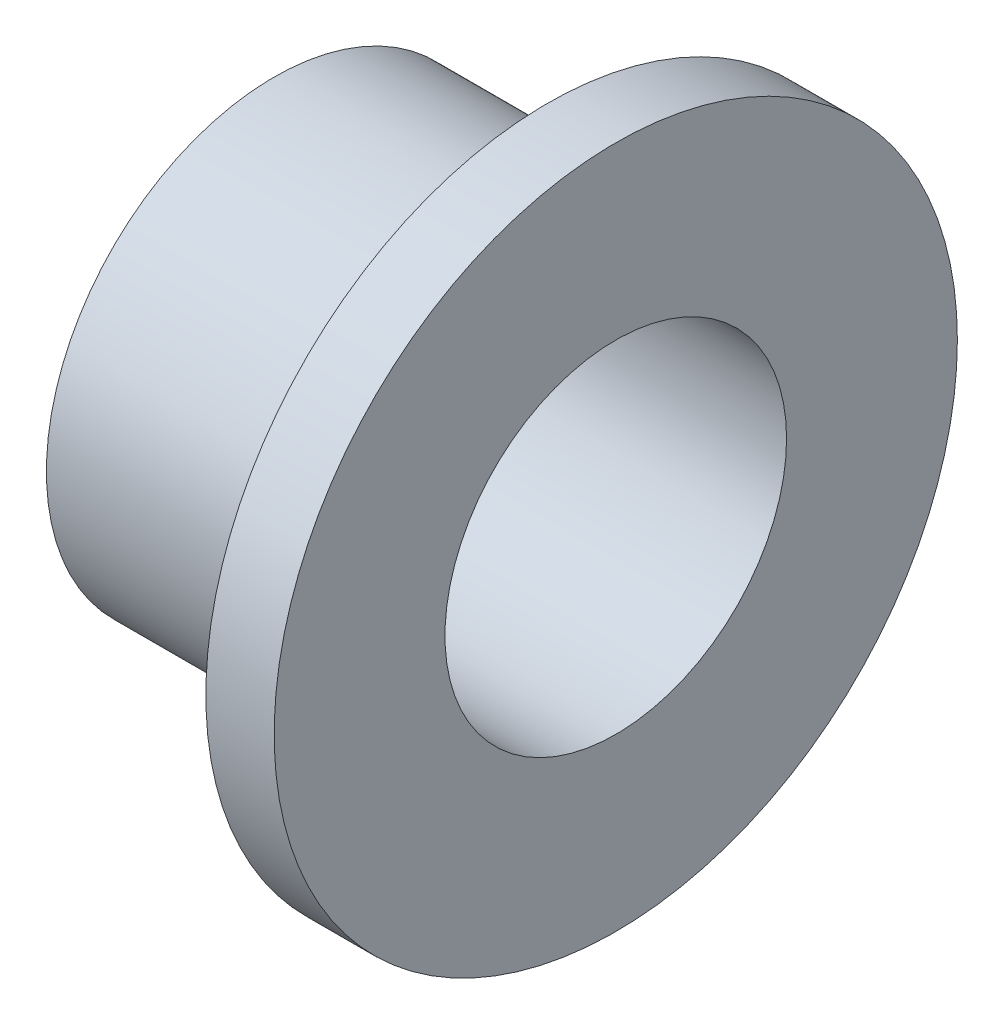
ISO-10303-21;
HEADER;
FILE_DESCRIPTION(('STEP AP214'),'2;1');
FILE_NAME('part.step','',(''),(''),'','','');
FILE_SCHEMA(('AUTOMOTIVE_DESIGN { 1 0 10303 214 1 1 1 1 }'));
ENDSEC;
DATA;
#1=APPLICATION_CONTEXT('core data for automotive mechanical design processes');
#2=APPLICATION_PROTOCOL_DEFINITION('international standard','automotive_design',2000,#1);
#3=PRODUCT_CONTEXT('',#1,'mechanical');
#4=PRODUCT('Part','Part','',(#3));
#5=PRODUCT_RELATED_PRODUCT_CATEGORY('part','',(#4));
#6=PRODUCT_DEFINITION_FORMATION('','',#4);
#7=PRODUCT_DEFINITION_CONTEXT('part definition',#1,'design');
#8=PRODUCT_DEFINITION('design','',#6,#7);
#9=PRODUCT_DEFINITION_SHAPE('','',#8);
#10=(LENGTH_UNIT() NAMED_UNIT(*) SI_UNIT(.MILLI.,.METRE.));
#11=(NAMED_UNIT(*) PLANE_ANGLE_UNIT() SI_UNIT($,.RADIAN.));
#12=(NAMED_UNIT(*) SI_UNIT($,.STERADIAN.) SOLID_ANGLE_UNIT());
#13=UNCERTAINTY_MEASURE_WITH_UNIT(LENGTH_MEASURE(1.E-05),#10,'distance_accuracy_value','');
#14=(GEOMETRIC_REPRESENTATION_CONTEXT(3) GLOBAL_UNCERTAINTY_ASSIGNED_CONTEXT((#13)) GLOBAL_UNIT_ASSIGNED_CONTEXT((#10,
#11,#12)) REPRESENTATION_CONTEXT('',''));
#15=CARTESIAN_POINT('',(0.,0.,0.));
#16=DIRECTION('',(0.,0.,1.));
#17=DIRECTION('',(1.,0.,0.));
#18=AXIS2_PLACEMENT_3D('',#15,#16,#17);
#19=CARTESIAN_POINT('',(0.,0.,0.));
#20=DIRECTION('',(1.,0.,0.));
#21=DIRECTION('',(0.,0.,-1.));
#22=AXIS2_PLACEMENT_3D('',#19,#20,#21);
#23=CYLINDRICAL_SURFACE('',#22,6.);
#24=CARTESIAN_POINT('',(0.,0.,0.));
#25=DIRECTION('',(1.,0.,0.));
#26=DIRECTION('',(0.,0.,-1.));
#27=AXIS2_PLACEMENT_3D('',#24,#25,#26);
#28=CIRCLE('',#27,6.);
#29=CARTESIAN_POINT('',(0.,0.,-6.));
#30=VERTEX_POINT('',#29);
#31=EDGE_CURVE('E10',#30,#30,#28,.T.);
#32=ORIENTED_EDGE('',*,*,#31,.F.);
#33=EDGE_LOOP('',(#32));
#34=FACE_BOUND('',#33,.T.);
#35=CARTESIAN_POINT('',(-1.2,0.,0.));
#36=DIRECTION('',(1.,0.,0.));
#37=DIRECTION('',(0.,0.,-1.));
#38=AXIS2_PLACEMENT_3D('',#35,#36,#37);
#39=CIRCLE('',#38,6.);
#40=CARTESIAN_POINT('',(-1.2,0.,-6.));
#41=VERTEX_POINT('',#40);
#42=EDGE_CURVE('E59',#41,#41,#39,.T.);
#43=ORIENTED_EDGE('',*,*,#42,.T.);
#44=EDGE_LOOP('',(#43));
#45=FACE_BOUND('',#44,.T.);
#46=ADVANCED_FACE('F37',(#34,#45),#23,.T.);
#47=CARTESIAN_POINT('',(0.,0.,6.));
#48=DIRECTION('',(-1.,0.,0.));
#49=DIRECTION('',(0.,0.,1.));
#50=AXIS2_PLACEMENT_3D('',#47,#48,#49);
#51=PLANE('',#50);
#52=CARTESIAN_POINT('',(0.,0.,0.));
#53=DIRECTION('',(1.,0.,0.));
#54=DIRECTION('',(0.,0.,-1.));
#55=AXIS2_PLACEMENT_3D('',#52,#53,#54);
#56=CIRCLE('',#55,3.);
#57=CARTESIAN_POINT('',(0.,0.,-3.));
#58=VERTEX_POINT('',#57);
#59=EDGE_CURVE('E43',#58,#58,#56,.T.);
#60=ORIENTED_EDGE('',*,*,#59,.F.);
#61=EDGE_LOOP('',(#60));
#62=FACE_BOUND('',#61,.T.);
#63=ORIENTED_EDGE('',*,*,#31,.T.);
#64=EDGE_LOOP('',(#63));
#65=FACE_BOUND('',#64,.T.);
#66=ADVANCED_FACE('F84',(#62,#65),#51,.F.);
#67=CARTESIAN_POINT('',(0.,0.,0.));
#68=DIRECTION('',(1.,0.,0.));
#69=DIRECTION('',(0.,0.,-1.));
#70=AXIS2_PLACEMENT_3D('',#67,#68,#69);
#71=CYLINDRICAL_SURFACE('',#70,3.);
#72=CARTESIAN_POINT('',(-6.,0.,0.));
#73=DIRECTION('',(1.,0.,0.));
#74=DIRECTION('',(0.,0.,-1.));
#75=AXIS2_PLACEMENT_3D('',#72,#73,#74);
#76=CIRCLE('',#75,3.);
#77=CARTESIAN_POINT('',(-6.,0.,-3.));
#78=VERTEX_POINT('',#77);
#79=EDGE_CURVE('E47',#78,#78,#76,.T.);
#80=ORIENTED_EDGE('',*,*,#79,.F.);
#81=EDGE_LOOP('',(#80));
#82=FACE_BOUND('',#81,.T.);
#83=ORIENTED_EDGE('',*,*,#59,.T.);
#84=EDGE_LOOP('',(#83));
#85=FACE_BOUND('',#84,.T.);
#86=ADVANCED_FACE('F79',(#82,#85),#71,.F.);
#87=CARTESIAN_POINT('',(-6.,0.,3.));
#88=DIRECTION('',(1.,0.,0.));
#89=DIRECTION('',(0.,0.,-1.));
#90=AXIS2_PLACEMENT_3D('',#87,#88,#89);
#91=PLANE('',#90);
#92=CARTESIAN_POINT('',(-6.,0.,0.));
#93=DIRECTION('',(1.,0.,0.));
#94=DIRECTION('',(0.,0.,-1.));
#95=AXIS2_PLACEMENT_3D('',#92,#93,#94);
#96=CIRCLE('',#95,4.);
#97=CARTESIAN_POINT('',(-6.,0.,-4.));
#98=VERTEX_POINT('',#97);
#99=EDGE_CURVE('E51',#98,#98,#96,.T.);
#100=ORIENTED_EDGE('',*,*,#99,.F.);
#101=EDGE_LOOP('',(#100));
#102=FACE_BOUND('',#101,.T.);
#103=ORIENTED_EDGE('',*,*,#79,.T.);
#104=EDGE_LOOP('',(#103));
#105=FACE_BOUND('',#104,.T.);
#106=ADVANCED_FACE('F73',(#102,#105),#91,.F.);
#107=CARTESIAN_POINT('',(0.,0.,0.));
#108=DIRECTION('',(1.,0.,0.));
#109=DIRECTION('',(0.,0.,-1.));
#110=AXIS2_PLACEMENT_3D('',#107,#108,#109);
#111=CYLINDRICAL_SURFACE('',#110,4.);
#112=CARTESIAN_POINT('',(-1.2,0.,0.));
#113=DIRECTION('',(1.,0.,0.));
#114=DIRECTION('',(0.,0.,-1.));
#115=AXIS2_PLACEMENT_3D('',#112,#113,#114);
#116=CIRCLE('',#115,4.);
#117=CARTESIAN_POINT('',(-1.2,0.,-4.));
#118=VERTEX_POINT('',#117);
#119=EDGE_CURVE('E56',#118,#118,#116,.T.);
#120=ORIENTED_EDGE('',*,*,#119,.F.);
#121=EDGE_LOOP('',(#120));
#122=FACE_BOUND('',#121,.T.);
#123=ORIENTED_EDGE('',*,*,#99,.T.);
#124=EDGE_LOOP('',(#123));
#125=FACE_BOUND('',#124,.T.);
#126=ADVANCED_FACE('F67',(#122,#125),#111,.T.);
#127=CARTESIAN_POINT('',(-1.2,0.,4.));
#128=DIRECTION('',(1.,0.,0.));
#129=DIRECTION('',(0.,0.,-1.));
#130=AXIS2_PLACEMENT_3D('',#127,#128,#129);
#131=PLANE('',#130);
#132=ORIENTED_EDGE('',*,*,#42,.F.);
#133=EDGE_LOOP('',(#132));
#134=FACE_BOUND('',#133,.T.);
#135=ORIENTED_EDGE('',*,*,#119,.T.);
#136=EDGE_LOOP('',(#135));
#137=FACE_BOUND('',#136,.T.);
#138=ADVANCED_FACE('F64',(#134,#137),#131,.F.);
#139=CLOSED_SHELL('',(#46,#66,#86,#106,#126,#138));
#140=MANIFOLD_SOLID_BREP('B2',#139);
#141=ADVANCED_BREP_SHAPE_REPRESENTATION('',(#18,#140),#14);
#142=SHAPE_DEFINITION_REPRESENTATION(#9,#141);
ENDSEC;
END-ISO-10303-21;
